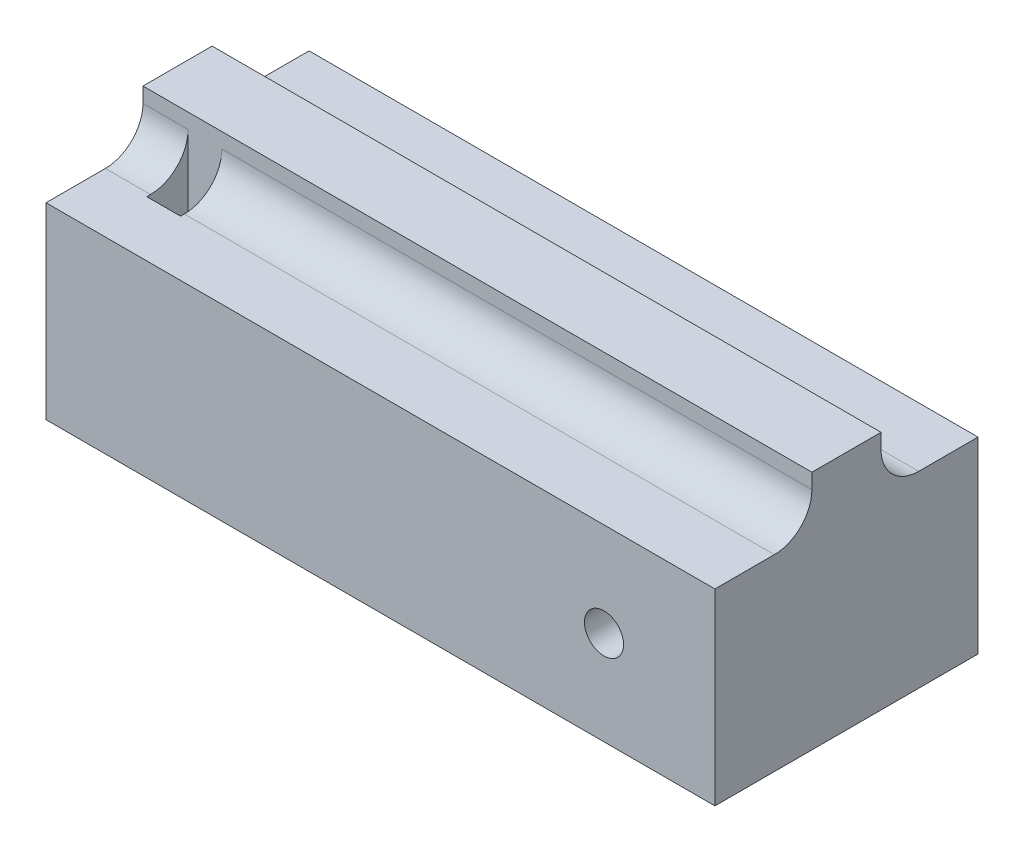
ISO-10303-21;
HEADER;
FILE_DESCRIPTION(('STEP AP214'),'2;1');
FILE_NAME('part.step','',(''),(''),'','','');
FILE_SCHEMA(('AUTOMOTIVE_DESIGN { 1 0 10303 214 1 1 1 1 }'));
ENDSEC;
DATA;
#1=APPLICATION_CONTEXT('core data for automotive mechanical design processes');
#2=APPLICATION_PROTOCOL_DEFINITION('international standard','automotive_design',2000,#1);
#3=PRODUCT_CONTEXT('',#1,'mechanical');
#4=PRODUCT('Part','Part','',(#3));
#5=PRODUCT_RELATED_PRODUCT_CATEGORY('part','',(#4));
#6=PRODUCT_DEFINITION_FORMATION('','',#4);
#7=PRODUCT_DEFINITION_CONTEXT('part definition',#1,'design');
#8=PRODUCT_DEFINITION('design','',#6,#7);
#9=PRODUCT_DEFINITION_SHAPE('','',#8);
#10=(LENGTH_UNIT() NAMED_UNIT(*) SI_UNIT(.MILLI.,.METRE.));
#11=(NAMED_UNIT(*) PLANE_ANGLE_UNIT() SI_UNIT($,.RADIAN.));
#12=(NAMED_UNIT(*) SI_UNIT($,.STERADIAN.) SOLID_ANGLE_UNIT());
#13=UNCERTAINTY_MEASURE_WITH_UNIT(LENGTH_MEASURE(1.E-05),#10,'distance_accuracy_value','');
#14=(GEOMETRIC_REPRESENTATION_CONTEXT(3) GLOBAL_UNCERTAINTY_ASSIGNED_CONTEXT((#13)) GLOBAL_UNIT_ASSIGNED_CONTEXT((#10,
#11,#12)) REPRESENTATION_CONTEXT('',''));
#15=CARTESIAN_POINT('',(0.,0.,0.));
#16=DIRECTION('',(0.,0.,1.));
#17=DIRECTION('',(1.,0.,0.));
#18=AXIS2_PLACEMENT_3D('',#15,#16,#17);
#19=CARTESIAN_POINT('',(-121.,45.01,113.404197468692));
#20=DIRECTION('',(1.,0.,0.));
#21=DIRECTION('',(0.,0.,-1.));
#22=AXIS2_PLACEMENT_3D('',#19,#20,#21);
#23=PLANE('',#22);
#24=CARTESIAN_POINT('',(-121.,30.,9.6));
#25=DIRECTION('',(1.,0.,0.));
#26=DIRECTION('',(0.,0.,-1.));
#27=AXIS2_PLACEMENT_3D('',#24,#25,#26);
#28=CIRCLE('',#27,5.);
#29=CARTESIAN_POINT('',(-121.,30.,4.6));
#30=VERTEX_POINT('',#29);
#31=CARTESIAN_POINT('',(-121.,25.,9.6));
#32=VERTEX_POINT('',#31);
#33=EDGE_CURVE('E40',#30,#32,#28,.F.);
#34=ORIENTED_EDGE('',*,*,#33,.T.);
#35=DIRECTION('',(0.,0.,1.));
#36=VECTOR('',#35,1.);
#37=CARTESIAN_POINT('',(-121.,25.,0.));
#38=LINE('',#37,#36);
#39=CARTESIAN_POINT('',(-121.,25.,17.5));
#40=VERTEX_POINT('',#39);
#41=EDGE_CURVE('E365',#32,#40,#38,.T.);
#42=ORIENTED_EDGE('',*,*,#41,.T.);
#43=DIRECTION('',(0.,-1.,0.));
#44=VECTOR('',#43,1.);
#45=CARTESIAN_POINT('',(-121.,25.,17.5));
#46=LINE('',#45,#44);
#47=CARTESIAN_POINT('',(-121.,0.,17.5));
#48=VERTEX_POINT('',#47);
#49=EDGE_CURVE('E362',#40,#48,#46,.T.);
#50=ORIENTED_EDGE('',*,*,#49,.T.);
#51=DIRECTION('',(0.,0.,1.));
#52=VECTOR('',#51,1.);
#53=CARTESIAN_POINT('',(-121.,0.,0.));
#54=LINE('',#53,#52);
#55=CARTESIAN_POINT('',(-121.,0.,-17.5));
#56=VERTEX_POINT('',#55);
#57=EDGE_CURVE('E368',#56,#48,#54,.T.);
#58=ORIENTED_EDGE('',*,*,#57,.F.);
#59=DIRECTION('',(0.,-1.,0.));
#60=VECTOR('',#59,1.);
#61=CARTESIAN_POINT('',(-121.,25.,-17.5));
#62=LINE('',#61,#60);
#63=CARTESIAN_POINT('',(-121.,25.,-17.5));
#64=VERTEX_POINT('',#63);
#65=EDGE_CURVE('E366',#64,#56,#62,.T.);
#66=ORIENTED_EDGE('',*,*,#65,.F.);
#67=DIRECTION('',(0.,0.,1.));
#68=VECTOR('',#67,1.);
#69=CARTESIAN_POINT('',(-121.,25.,0.));
#70=LINE('',#69,#68);
#71=CARTESIAN_POINT('',(-121.,25.,-9.60000000000003));
#72=VERTEX_POINT('',#71);
#73=EDGE_CURVE('E363',#64,#72,#70,.T.);
#74=ORIENTED_EDGE('',*,*,#73,.T.);
#75=CARTESIAN_POINT('',(-121.,30.,-9.60000000000003));
#76=DIRECTION('',(1.,0.,0.));
#77=DIRECTION('',(0.,0.,-1.));
#78=AXIS2_PLACEMENT_3D('',#75,#76,#77);
#79=CIRCLE('',#78,5.);
#80=CARTESIAN_POINT('',(-121.,30.,-4.60000000000003));
#81=VERTEX_POINT('',#80);
#82=EDGE_CURVE('E11',#72,#81,#79,.F.);
#83=ORIENTED_EDGE('',*,*,#82,.T.);
#84=DIRECTION('',(0.,1.,0.));
#85=VECTOR('',#84,1.);
#86=CARTESIAN_POINT('',(-121.,-21.,-4.60000000000003));
#87=LINE('',#86,#85);
#88=CARTESIAN_POINT('',(-121.,32.,-4.60000000000005));
#89=VERTEX_POINT('',#88);
#90=EDGE_CURVE('E359',#81,#89,#87,.T.);
#91=ORIENTED_EDGE('',*,*,#90,.T.);
#92=DIRECTION('',(0.,0.,-1.));
#93=VECTOR('',#92,1.);
#94=CARTESIAN_POINT('',(-121.,32.,0.));
#95=LINE('',#94,#93);
#96=CARTESIAN_POINT('',(-121.,32.,4.60000000000009));
#97=VERTEX_POINT('',#96);
#98=EDGE_CURVE('E178',#97,#89,#95,.T.);
#99=ORIENTED_EDGE('',*,*,#98,.F.);
#100=DIRECTION('',(0.,-1.,0.));
#101=VECTOR('',#100,1.);
#102=CARTESIAN_POINT('',(-121.,-21.,4.6));
#103=LINE('',#102,#101);
#104=EDGE_CURVE('E361',#97,#30,#103,.T.);
#105=ORIENTED_EDGE('',*,*,#104,.T.);
#106=EDGE_LOOP('',(#34,#42,#50,#58,#66,#74,#83,#91,#99,#105));
#107=FACE_BOUND('',#106,.T.);
#108=ADVANCED_FACE('F32',(#107),#23,.T.);
#109=CARTESIAN_POINT('',(-200.,12.5,0.));
#110=DIRECTION('',(-1.,0.,0.));
#111=DIRECTION('',(0.,0.,1.));
#112=AXIS2_PLACEMENT_3D('',#109,#110,#111);
#113=PLANE('',#112);
#114=CARTESIAN_POINT('',(-200.,12.5,0.));
#115=DIRECTION('',(-1.,0.,0.));
#116=DIRECTION('',(0.,0.,1.));
#117=AXIS2_PLACEMENT_3D('',#114,#115,#116);
#118=CIRCLE('',#117,2.38063164328391);
#119=CARTESIAN_POINT('',(-200.,12.5,2.38063164328383));
#120=VERTEX_POINT('',#119);
#121=EDGE_CURVE('E201',#120,#120,#118,.T.);
#122=ORIENTED_EDGE('',*,*,#121,.T.);
#123=EDGE_LOOP('',(#122));
#124=FACE_BOUND('',#123,.T.);
#125=ADVANCED_FACE('F446',(#124),#113,.T.);
#126=CARTESIAN_POINT('',(-180.,19.25,7.8));
#127=DIRECTION('',(-1.,0.,0.));
#128=DIRECTION('',(0.,0.,1.));
#129=AXIS2_PLACEMENT_3D('',#126,#127,#128);
#130=PLANE('',#129);
#131=CARTESIAN_POINT('',(-180.,19.25,7.8));
#132=DIRECTION('',(-1.,0.,0.));
#133=DIRECTION('',(0.,0.,1.));
#134=AXIS2_PLACEMENT_3D('',#131,#132,#133);
#135=CIRCLE('',#134,2.);
#136=CARTESIAN_POINT('',(-180.,19.25,9.8));
#137=VERTEX_POINT('',#136);
#138=EDGE_CURVE('E286',#137,#137,#135,.T.);
#139=ORIENTED_EDGE('',*,*,#138,.T.);
#140=EDGE_LOOP('',(#139));
#141=FACE_BOUND('',#140,.T.);
#142=ADVANCED_FACE('F450',(#141),#130,.T.);
#143=CARTESIAN_POINT('',(-180.,5.75,7.8));
#144=DIRECTION('',(-1.,0.,0.));
#145=DIRECTION('',(0.,0.,1.));
#146=AXIS2_PLACEMENT_3D('',#143,#144,#145);
#147=PLANE('',#146);
#148=CARTESIAN_POINT('',(-180.,5.75,7.8));
#149=DIRECTION('',(-1.,0.,0.));
#150=DIRECTION('',(0.,0.,1.));
#151=AXIS2_PLACEMENT_3D('',#148,#149,#150);
#152=CIRCLE('',#151,2.);
#153=CARTESIAN_POINT('',(-180.,5.75,9.8));
#154=VERTEX_POINT('',#153);
#155=EDGE_CURVE('E268',#154,#154,#152,.T.);
#156=ORIENTED_EDGE('',*,*,#155,.T.);
#157=EDGE_LOOP('',(#156));
#158=FACE_BOUND('',#157,.T.);
#159=ADVANCED_FACE('F491',(#158),#147,.T.);
#160=CARTESIAN_POINT('',(-180.,5.75,-7.8));
#161=DIRECTION('',(-1.,0.,0.));
#162=DIRECTION('',(0.,0.,1.));
#163=AXIS2_PLACEMENT_3D('',#160,#161,#162);
#164=PLANE('',#163);
#165=CARTESIAN_POINT('',(-180.,5.75,-7.8));
#166=DIRECTION('',(-1.,0.,0.));
#167=DIRECTION('',(0.,0.,1.));
#168=AXIS2_PLACEMENT_3D('',#165,#166,#167);
#169=CIRCLE('',#168,2.);
#170=CARTESIAN_POINT('',(-180.,5.75,-5.8));
#171=VERTEX_POINT('',#170);
#172=EDGE_CURVE('E275',#171,#171,#169,.T.);
#173=ORIENTED_EDGE('',*,*,#172,.T.);
#174=EDGE_LOOP('',(#173));
#175=FACE_BOUND('',#174,.T.);
#176=ADVANCED_FACE('F494',(#175),#164,.T.);
#177=CARTESIAN_POINT('',(-180.,19.25,-7.8));
#178=DIRECTION('',(-1.,0.,0.));
#179=DIRECTION('',(0.,0.,1.));
#180=AXIS2_PLACEMENT_3D('',#177,#178,#179);
#181=PLANE('',#180);
#182=CARTESIAN_POINT('',(-180.,19.25,-7.8));
#183=DIRECTION('',(-1.,0.,0.));
#184=DIRECTION('',(0.,0.,1.));
#185=AXIS2_PLACEMENT_3D('',#182,#183,#184);
#186=CIRCLE('',#185,2.);
#187=CARTESIAN_POINT('',(-180.,19.25,-5.79999999999999));
#188=VERTEX_POINT('',#187);
#189=EDGE_CURVE('E281',#188,#188,#186,.T.);
#190=ORIENTED_EDGE('',*,*,#189,.T.);
#191=EDGE_LOOP('',(#190));
#192=FACE_BOUND('',#191,.T.);
#193=ADVANCED_FACE('F505',(#192),#181,.T.);
#194=CARTESIAN_POINT('',(-180.,19.25,7.8));
#195=DIRECTION('',(-1.,0.,0.));
#196=DIRECTION('',(0.,0.,1.));
#197=AXIS2_PLACEMENT_3D('',#194,#195,#196);
#198=CYLINDRICAL_SURFACE('',#197,2.);
#199=CARTESIAN_POINT('',(-204.,19.25,7.8));
#200=DIRECTION('',(-1.,0.,0.));
#201=DIRECTION('',(0.,0.,1.));
#202=AXIS2_PLACEMENT_3D('',#199,#200,#201);
#203=CIRCLE('',#202,2.);
#204=CARTESIAN_POINT('',(-204.,19.25,9.8));
#205=VERTEX_POINT('',#204);
#206=EDGE_CURVE('E256',#205,#205,#203,.F.);
#207=ORIENTED_EDGE('',*,*,#206,.T.);
#208=EDGE_LOOP('',(#207));
#209=FACE_BOUND('',#208,.T.);
#210=CARTESIAN_POINT('',(-210.,19.25,7.8));
#211=DIRECTION('',(-1.,0.,0.));
#212=DIRECTION('',(0.,0.,1.));
#213=AXIS2_PLACEMENT_3D('',#210,#211,#212);
#214=CIRCLE('',#213,2.);
#215=CARTESIAN_POINT('',(-210.,19.25,9.8));
#216=VERTEX_POINT('',#215);
#217=EDGE_CURVE('E271',#216,#216,#214,.T.);
#218=ORIENTED_EDGE('',*,*,#217,.T.);
#219=EDGE_LOOP('',(#218));
#220=FACE_BOUND('',#219,.T.);
#221=ADVANCED_FACE('F500',(#209,#220),#198,.F.);
#222=CARTESIAN_POINT('',(-180.,5.75,7.8));
#223=DIRECTION('',(-1.,0.,0.));
#224=DIRECTION('',(0.,0.,1.));
#225=AXIS2_PLACEMENT_3D('',#222,#223,#224);
#226=CYLINDRICAL_SURFACE('',#225,2.);
#227=CARTESIAN_POINT('',(-204.,5.75,7.8));
#228=DIRECTION('',(-1.,0.,0.));
#229=DIRECTION('',(0.,0.,1.));
#230=AXIS2_PLACEMENT_3D('',#227,#228,#229);
#231=CIRCLE('',#230,2.);
#232=CARTESIAN_POINT('',(-204.,5.75,9.8));
#233=VERTEX_POINT('',#232);
#234=EDGE_CURVE('E255',#233,#233,#231,.F.);
#235=ORIENTED_EDGE('',*,*,#234,.T.);
#236=EDGE_LOOP('',(#235));
#237=FACE_BOUND('',#236,.T.);
#238=CARTESIAN_POINT('',(-210.,5.75,7.8));
#239=DIRECTION('',(-1.,0.,0.));
#240=DIRECTION('',(0.,0.,1.));
#241=AXIS2_PLACEMENT_3D('',#238,#239,#240);
#242=CIRCLE('',#241,2.);
#243=CARTESIAN_POINT('',(-210.,5.75,9.8));
#244=VERTEX_POINT('',#243);
#245=EDGE_CURVE('E272',#244,#244,#242,.T.);
#246=ORIENTED_EDGE('',*,*,#245,.T.);
#247=EDGE_LOOP('',(#246));
#248=FACE_BOUND('',#247,.T.);
#249=ADVANCED_FACE('F496',(#237,#248),#226,.F.);
#250=CARTESIAN_POINT('',(-180.,5.75,-7.8));
#251=DIRECTION('',(-1.,0.,0.));
#252=DIRECTION('',(0.,0.,1.));
#253=AXIS2_PLACEMENT_3D('',#250,#251,#252);
#254=CYLINDRICAL_SURFACE('',#253,2.);
#255=CARTESIAN_POINT('',(-204.,5.75,-7.8));
#256=DIRECTION('',(-1.,0.,0.));
#257=DIRECTION('',(0.,0.,1.));
#258=AXIS2_PLACEMENT_3D('',#255,#256,#257);
#259=CIRCLE('',#258,2.);
#260=CARTESIAN_POINT('',(-204.,5.75,-5.8));
#261=VERTEX_POINT('',#260);
#262=EDGE_CURVE('E244',#261,#261,#259,.F.);
#263=ORIENTED_EDGE('',*,*,#262,.T.);
#264=EDGE_LOOP('',(#263));
#265=FACE_BOUND('',#264,.T.);
#266=CARTESIAN_POINT('',(-210.,5.75,-7.8));
#267=DIRECTION('',(-1.,0.,0.));
#268=DIRECTION('',(0.,0.,1.));
#269=AXIS2_PLACEMENT_3D('',#266,#267,#268);
#270=CIRCLE('',#269,2.);
#271=CARTESIAN_POINT('',(-210.,5.75,-5.8));
#272=VERTEX_POINT('',#271);
#273=EDGE_CURVE('E278',#272,#272,#270,.T.);
#274=ORIENTED_EDGE('',*,*,#273,.T.);
#275=EDGE_LOOP('',(#274));
#276=FACE_BOUND('',#275,.T.);
#277=ADVANCED_FACE('F499',(#265,#276),#254,.F.);
#278=CARTESIAN_POINT('',(-180.,19.25,-7.8));
#279=DIRECTION('',(-1.,0.,0.));
#280=DIRECTION('',(0.,0.,1.));
#281=AXIS2_PLACEMENT_3D('',#278,#279,#280);
#282=CYLINDRICAL_SURFACE('',#281,2.);
#283=CARTESIAN_POINT('',(-204.,19.25,-7.8));
#284=DIRECTION('',(-1.,0.,0.));
#285=DIRECTION('',(0.,0.,1.));
#286=AXIS2_PLACEMENT_3D('',#283,#284,#285);
#287=CIRCLE('',#286,2.);
#288=CARTESIAN_POINT('',(-204.,19.25,-5.79999999999999));
#289=VERTEX_POINT('',#288);
#290=EDGE_CURVE('E221',#289,#289,#287,.F.);
#291=ORIENTED_EDGE('',*,*,#290,.T.);
#292=EDGE_LOOP('',(#291));
#293=FACE_BOUND('',#292,.T.);
#294=CARTESIAN_POINT('',(-210.,19.25,-7.8));
#295=DIRECTION('',(-1.,0.,0.));
#296=DIRECTION('',(0.,0.,1.));
#297=AXIS2_PLACEMENT_3D('',#294,#295,#296);
#298=CIRCLE('',#297,2.);
#299=CARTESIAN_POINT('',(-210.,19.25,-5.79999999999999));
#300=VERTEX_POINT('',#299);
#301=EDGE_CURVE('E267',#300,#300,#298,.T.);
#302=ORIENTED_EDGE('',*,*,#301,.T.);
#303=EDGE_LOOP('',(#302));
#304=FACE_BOUND('',#303,.T.);
#305=ADVANCED_FACE('F468',(#293,#304),#282,.F.);
#306=CARTESIAN_POINT('',(-200.,12.5,0.));
#307=DIRECTION('',(-1.,0.,0.));
#308=DIRECTION('',(0.,0.,1.));
#309=AXIS2_PLACEMENT_3D('',#306,#307,#308);
#310=CYLINDRICAL_SURFACE('',#309,2.38063164328391);
#311=ORIENTED_EDGE('',*,*,#121,.F.);
#312=EDGE_LOOP('',(#311));
#313=FACE_BOUND('',#312,.T.);
#314=CARTESIAN_POINT('',(-210.,12.5,0.));
#315=DIRECTION('',(-1.,0.,0.));
#316=DIRECTION('',(0.,0.,1.));
#317=AXIS2_PLACEMENT_3D('',#314,#315,#316);
#318=CIRCLE('',#317,2.38063164328391);
#319=CARTESIAN_POINT('',(-210.,12.5,2.38063164328383));
#320=VERTEX_POINT('',#319);
#321=EDGE_CURVE('E198',#320,#320,#318,.T.);
#322=ORIENTED_EDGE('',*,*,#321,.T.);
#323=EDGE_LOOP('',(#322));
#324=FACE_BOUND('',#323,.T.);
#325=ADVANCED_FACE('F464',(#313,#324),#310,.F.);
#326=CARTESIAN_POINT('',(-199.5,19.25,7.8));
#327=DIRECTION('',(1.,0.,0.));
#328=DIRECTION('',(0.,0.,-1.));
#329=AXIS2_PLACEMENT_3D('',#326,#327,#328);
#330=CIRCLE('',#329,2.);
#331=CARTESIAN_POINT('',(-199.5,19.25,5.80000000000001));
#332=VERTEX_POINT('',#331);
#333=EDGE_CURVE('E262',#332,#332,#330,.F.);
#334=ORIENTED_EDGE('',*,*,#333,.T.);
#335=EDGE_LOOP('',(#334));
#336=FACE_BOUND('',#335,.T.);
#337=ORIENTED_EDGE('',*,*,#138,.F.);
#338=EDGE_LOOP('',(#337));
#339=FACE_BOUND('',#338,.T.);
#340=ADVANCED_FACE('F467',(#336,#339),#198,.F.);
#341=CARTESIAN_POINT('',(-199.5,5.75,7.8));
#342=DIRECTION('',(1.,0.,0.));
#343=DIRECTION('',(0.,0.,-1.));
#344=AXIS2_PLACEMENT_3D('',#341,#342,#343);
#345=CIRCLE('',#344,2.);
#346=CARTESIAN_POINT('',(-199.5,5.75,5.8));
#347=VERTEX_POINT('',#346);
#348=EDGE_CURVE('E261',#347,#347,#345,.F.);
#349=ORIENTED_EDGE('',*,*,#348,.T.);
#350=EDGE_LOOP('',(#349));
#351=FACE_BOUND('',#350,.T.);
#352=ORIENTED_EDGE('',*,*,#155,.F.);
#353=EDGE_LOOP('',(#352));
#354=FACE_BOUND('',#353,.T.);
#355=ADVANCED_FACE('F502',(#351,#354),#226,.F.);
#356=CARTESIAN_POINT('',(-199.5,5.75,-7.8));
#357=DIRECTION('',(1.,0.,0.));
#358=DIRECTION('',(0.,0.,-1.));
#359=AXIS2_PLACEMENT_3D('',#356,#357,#358);
#360=CIRCLE('',#359,2.);
#361=CARTESIAN_POINT('',(-199.5,5.75,-9.8));
#362=VERTEX_POINT('',#361);
#363=EDGE_CURVE('E250',#362,#362,#360,.F.);
#364=ORIENTED_EDGE('',*,*,#363,.T.);
#365=EDGE_LOOP('',(#364));
#366=FACE_BOUND('',#365,.T.);
#367=ORIENTED_EDGE('',*,*,#172,.F.);
#368=EDGE_LOOP('',(#367));
#369=FACE_BOUND('',#368,.T.);
#370=ADVANCED_FACE('F510',(#366,#369),#254,.F.);
#371=CARTESIAN_POINT('',(-199.5,19.25,-7.8));
#372=DIRECTION('',(1.,0.,0.));
#373=DIRECTION('',(0.,0.,-1.));
#374=AXIS2_PLACEMENT_3D('',#371,#372,#373);
#375=CIRCLE('',#374,2.);
#376=CARTESIAN_POINT('',(-199.5,19.25,-9.8));
#377=VERTEX_POINT('',#376);
#378=EDGE_CURVE('E249',#377,#377,#375,.F.);
#379=ORIENTED_EDGE('',*,*,#378,.T.);
#380=EDGE_LOOP('',(#379));
#381=FACE_BOUND('',#380,.T.);
#382=ORIENTED_EDGE('',*,*,#189,.F.);
#383=EDGE_LOOP('',(#382));
#384=FACE_BOUND('',#383,.T.);
#385=ADVANCED_FACE('F442',(#381,#384),#282,.F.);
#386=CARTESIAN_POINT('',(-210.,25.,17.5));
#387=DIRECTION('',(0.,0.,-1.));
#388=DIRECTION('',(-1.,0.,0.));
#389=AXIS2_PLACEMENT_3D('',#386,#387,#388);
#390=PLANE('',#389);
#391=CARTESIAN_POINT('',(-135.759248767884,12.5,17.5));
#392=DIRECTION('',(0.,0.,-1.));
#393=DIRECTION('',(-1.,0.,0.));
#394=AXIS2_PLACEMENT_3D('',#391,#392,#393);
#395=CIRCLE('',#394,2.59999999999999);
#396=CARTESIAN_POINT('',(-138.359248767884,12.5,17.5));
#397=VERTEX_POINT('',#396);
#398=EDGE_CURVE('E182',#397,#397,#395,.T.);
#399=ORIENTED_EDGE('',*,*,#398,.T.);
#400=EDGE_LOOP('',(#399));
#401=FACE_BOUND('',#400,.T.);
#402=ORIENTED_EDGE('',*,*,#49,.F.);
#403=DIRECTION('',(1.,0.,0.));
#404=VECTOR('',#403,1.);
#405=CARTESIAN_POINT('',(-210.,25.,17.5));
#406=LINE('',#405,#404);
#407=CARTESIAN_POINT('',(-210.,25.,17.5));
#408=VERTEX_POINT('',#407);
#409=EDGE_CURVE('E299',#408,#40,#406,.T.);
#410=ORIENTED_EDGE('',*,*,#409,.F.);
#411=DIRECTION('',(0.,-1.,0.));
#412=VECTOR('',#411,1.);
#413=CARTESIAN_POINT('',(-210.,25.,17.5));
#414=LINE('',#413,#412);
#415=CARTESIAN_POINT('',(-210.,0.,17.5));
#416=VERTEX_POINT('',#415);
#417=EDGE_CURVE('E310',#408,#416,#414,.T.);
#418=ORIENTED_EDGE('',*,*,#417,.T.);
#419=DIRECTION('',(1.,0.,0.));
#420=VECTOR('',#419,1.);
#421=CARTESIAN_POINT('',(-210.,0.,17.5));
#422=LINE('',#421,#420);
#423=EDGE_CURVE('E307',#416,#48,#422,.T.);
#424=ORIENTED_EDGE('',*,*,#423,.T.);
#425=EDGE_LOOP('',(#402,#410,#418,#424));
#426=FACE_BOUND('',#425,.T.);
#427=ADVANCED_FACE('F385',(#401,#426),#390,.F.);
#428=CARTESIAN_POINT('',(-210.,25.,-17.5));
#429=DIRECTION('',(0.,0.,-1.));
#430=DIRECTION('',(-1.,0.,0.));
#431=AXIS2_PLACEMENT_3D('',#428,#429,#430);
#432=PLANE('',#431);
#433=CARTESIAN_POINT('',(-135.759248767884,12.5,-17.5));
#434=DIRECTION('',(0.,0.,-1.));
#435=DIRECTION('',(-1.,0.,0.));
#436=AXIS2_PLACEMENT_3D('',#433,#434,#435);
#437=CIRCLE('',#436,2.59999999999999);
#438=CARTESIAN_POINT('',(-138.359248767884,12.5,-17.5));
#439=VERTEX_POINT('',#438);
#440=EDGE_CURVE('E35',#439,#439,#437,.T.);
#441=ORIENTED_EDGE('',*,*,#440,.F.);
#442=EDGE_LOOP('',(#441));
#443=FACE_BOUND('',#442,.T.);
#444=DIRECTION('',(1.,0.,0.));
#445=VECTOR('',#444,1.);
#446=CARTESIAN_POINT('',(-210.,25.,-17.5));
#447=LINE('',#446,#445);
#448=CARTESIAN_POINT('',(-210.,25.,-17.5));
#449=VERTEX_POINT('',#448);
#450=EDGE_CURVE('E295',#449,#64,#447,.T.);
#451=ORIENTED_EDGE('',*,*,#450,.T.);
#452=ORIENTED_EDGE('',*,*,#65,.T.);
#453=DIRECTION('',(1.,0.,0.));
#454=VECTOR('',#453,1.);
#455=CARTESIAN_POINT('',(-210.,0.,-17.5));
#456=LINE('',#455,#454);
#457=CARTESIAN_POINT('',(-210.,0.,-17.5));
#458=VERTEX_POINT('',#457);
#459=EDGE_CURVE('E304',#458,#56,#456,.T.);
#460=ORIENTED_EDGE('',*,*,#459,.F.);
#461=DIRECTION('',(0.,-1.,0.));
#462=VECTOR('',#461,1.);
#463=CARTESIAN_POINT('',(-210.,25.,-17.5));
#464=LINE('',#463,#462);
#465=EDGE_CURVE('E301',#449,#458,#464,.T.);
#466=ORIENTED_EDGE('',*,*,#465,.F.);
#467=EDGE_LOOP('',(#451,#452,#460,#466));
#468=FACE_BOUND('',#467,.T.);
#469=ADVANCED_FACE('F395',(#443,#468),#432,.T.);
#470=CARTESIAN_POINT('',(-204.,-21.,-10.1));
#471=DIRECTION('',(0.,0.,-1.));
#472=DIRECTION('',(-1.,0.,0.));
#473=AXIS2_PLACEMENT_3D('',#470,#471,#472);
#474=PLANE('',#473);
#475=DIRECTION('',(1.,0.,0.));
#476=VECTOR('',#475,1.);
#477=CARTESIAN_POINT('',(0.,0.,-10.1));
#478=LINE('',#477,#476);
#479=CARTESIAN_POINT('',(-204.,0.,-10.1));
#480=VERTEX_POINT('',#479);
#481=CARTESIAN_POINT('',(-199.5,0.,-10.1));
#482=VERTEX_POINT('',#481);
#483=EDGE_CURVE('E324',#480,#482,#478,.T.);
#484=ORIENTED_EDGE('',*,*,#483,.T.);
#485=DIRECTION('',(0.,1.,0.));
#486=VECTOR('',#485,1.);
#487=CARTESIAN_POINT('',(-199.5,-21.,-10.1));
#488=LINE('',#487,#486);
#489=CARTESIAN_POINT('',(-199.5,25.,-10.1));
#490=VERTEX_POINT('',#489);
#491=EDGE_CURVE('E212',#482,#490,#488,.T.);
#492=ORIENTED_EDGE('',*,*,#491,.T.);
#493=DIRECTION('',(-1.,0.,0.));
#494=VECTOR('',#493,1.);
#495=CARTESIAN_POINT('',(-204.,25.,-10.1));
#496=LINE('',#495,#494);
#497=CARTESIAN_POINT('',(-204.,25.,-10.1));
#498=VERTEX_POINT('',#497);
#499=EDGE_CURVE('E207',#490,#498,#496,.T.);
#500=ORIENTED_EDGE('',*,*,#499,.T.);
#501=DIRECTION('',(0.,1.,0.));
#502=VECTOR('',#501,1.);
#503=CARTESIAN_POINT('',(-204.,-21.,-10.1));
#504=LINE('',#503,#502);
#505=EDGE_CURVE('E234',#480,#498,#504,.T.);
#506=ORIENTED_EDGE('',*,*,#505,.F.);
#507=EDGE_LOOP('',(#484,#492,#500,#506));
#508=FACE_BOUND('',#507,.T.);
#509=ADVANCED_FACE('F408',(#508),#474,.F.);
#510=CARTESIAN_POINT('',(-199.5,-21.,10.1));
#511=DIRECTION('',(0.,0.,1.));
#512=DIRECTION('',(1.,0.,0.));
#513=AXIS2_PLACEMENT_3D('',#510,#511,#512);
#514=PLANE('',#513);
#515=DIRECTION('',(-1.,0.,0.));
#516=VECTOR('',#515,1.);
#517=CARTESIAN_POINT('',(0.,0.,10.0999999999999));
#518=LINE('',#517,#516);
#519=CARTESIAN_POINT('',(-199.5,0.,10.1));
#520=VERTEX_POINT('',#519);
#521=CARTESIAN_POINT('',(-204.,0.,10.1));
#522=VERTEX_POINT('',#521);
#523=EDGE_CURVE('E326',#520,#522,#518,.T.);
#524=ORIENTED_EDGE('',*,*,#523,.T.);
#525=DIRECTION('',(0.,1.,0.));
#526=VECTOR('',#525,1.);
#527=CARTESIAN_POINT('',(-204.,-21.,10.1));
#528=LINE('',#527,#526);
#529=CARTESIAN_POINT('',(-204.,25.,10.1));
#530=VERTEX_POINT('',#529);
#531=EDGE_CURVE('E224',#522,#530,#528,.T.);
#532=ORIENTED_EDGE('',*,*,#531,.T.);
#533=DIRECTION('',(1.,0.,0.));
#534=VECTOR('',#533,1.);
#535=CARTESIAN_POINT('',(-199.5,25.,10.1));
#536=LINE('',#535,#534);
#537=CARTESIAN_POINT('',(-199.5,25.,10.1));
#538=VERTEX_POINT('',#537);
#539=EDGE_CURVE('E211',#530,#538,#536,.T.);
#540=ORIENTED_EDGE('',*,*,#539,.T.);
#541=DIRECTION('',(0.,1.,0.));
#542=VECTOR('',#541,1.);
#543=CARTESIAN_POINT('',(-199.5,-21.,10.1));
#544=LINE('',#543,#542);
#545=EDGE_CURVE('E222',#520,#538,#544,.T.);
#546=ORIENTED_EDGE('',*,*,#545,.F.);
#547=EDGE_LOOP('',(#524,#532,#540,#546));
#548=FACE_BOUND('',#547,.T.);
#549=ADVANCED_FACE('F440',(#548),#514,.F.);
#550=CARTESIAN_POINT('',(-199.5,30.,-9.6));
#551=DIRECTION('',(1.,0.,0.));
#552=DIRECTION('',(0.,0.,-1.));
#553=AXIS2_PLACEMENT_3D('',#550,#551,#552);
#554=CYLINDRICAL_SURFACE('',#553,5.);
#555=CARTESIAN_POINT('',(-204.,30.,-9.6));
#556=DIRECTION('',(-1.,0.,0.));
#557=DIRECTION('',(0.,0.,1.));
#558=AXIS2_PLACEMENT_3D('',#555,#556,#557);
#559=CIRCLE('',#558,5.);
#560=CARTESIAN_POINT('',(-204.,25.,-9.6));
#561=VERTEX_POINT('',#560);
#562=CARTESIAN_POINT('',(-204.,30.,-4.6));
#563=VERTEX_POINT('',#562);
#564=EDGE_CURVE('E354',#561,#563,#559,.T.);
#565=ORIENTED_EDGE('',*,*,#564,.F.);
#566=DIRECTION('',(-1.,0.,0.));
#567=VECTOR('',#566,1.);
#568=CARTESIAN_POINT('',(-204.,25.,-9.6));
#569=LINE('',#568,#567);
#570=CARTESIAN_POINT('',(-210.,25.,-9.6));
#571=VERTEX_POINT('',#570);
#572=EDGE_CURVE('E343',#571,#561,#569,.F.);
#573=ORIENTED_EDGE('',*,*,#572,.F.);
#574=CARTESIAN_POINT('',(-210.,30.,-9.6));
#575=DIRECTION('',(-1.,0.,0.));
#576=DIRECTION('',(0.,0.,1.));
#577=AXIS2_PLACEMENT_3D('',#574,#575,#576);
#578=CIRCLE('',#577,5.);
#579=CARTESIAN_POINT('',(-210.,30.,-4.60000000000009));
#580=VERTEX_POINT('',#579);
#581=EDGE_CURVE('E352',#580,#571,#578,.F.);
#582=ORIENTED_EDGE('',*,*,#581,.F.);
#583=DIRECTION('',(-1.,0.,0.));
#584=VECTOR('',#583,1.);
#585=CARTESIAN_POINT('',(-210.,30.,-4.6));
#586=LINE('',#585,#584);
#587=EDGE_CURVE('E197',#563,#580,#586,.T.);
#588=ORIENTED_EDGE('',*,*,#587,.F.);
#589=EDGE_LOOP('',(#565,#573,#582,#588));
#590=FACE_BOUND('',#589,.T.);
#591=ADVANCED_FACE('F401',(#590),#554,.F.);
#592=CARTESIAN_POINT('',(-204.,-21.,-4.6));
#593=DIRECTION('',(-1.,0.,0.));
#594=DIRECTION('',(0.,0.,1.));
#595=AXIS2_PLACEMENT_3D('',#592,#593,#594);
#596=PLANE('',#595);
#597=DIRECTION('',(0.,0.,-1.));
#598=VECTOR('',#597,1.);
#599=CARTESIAN_POINT('',(-204.,0.,0.));
#600=LINE('',#599,#598);
#601=CARTESIAN_POINT('',(-204.,0.,-4.6));
#602=VERTEX_POINT('',#601);
#603=EDGE_CURVE('E247',#602,#480,#600,.T.);
#604=ORIENTED_EDGE('',*,*,#603,.T.);
#605=ORIENTED_EDGE('',*,*,#505,.T.);
#606=DIRECTION('',(0.,0.,1.));
#607=VECTOR('',#606,1.);
#608=CARTESIAN_POINT('',(-204.,25.,-4.6));
#609=LINE('',#608,#607);
#610=EDGE_CURVE('E229',#498,#561,#609,.T.);
#611=ORIENTED_EDGE('',*,*,#610,.T.);
#612=ORIENTED_EDGE('',*,*,#564,.T.);
#613=DIRECTION('',(0.,1.,0.));
#614=VECTOR('',#613,1.);
#615=CARTESIAN_POINT('',(-204.,-21.,-4.6));
#616=LINE('',#615,#614);
#617=EDGE_CURVE('E240',#602,#563,#616,.T.);
#618=ORIENTED_EDGE('',*,*,#617,.F.);
#619=EDGE_LOOP('',(#604,#605,#611,#612,#618));
#620=FACE_BOUND('',#619,.T.);
#621=ORIENTED_EDGE('',*,*,#290,.F.);
#622=EDGE_LOOP('',(#621));
#623=FACE_BOUND('',#622,.T.);
#624=ORIENTED_EDGE('',*,*,#262,.F.);
#625=EDGE_LOOP('',(#624));
#626=FACE_BOUND('',#625,.T.);
#627=ADVANCED_FACE('F403',(#620,#623,#626),#596,.F.);
#628=CARTESIAN_POINT('',(0.,0.,0.));
#629=DIRECTION('',(0.,-1.,0.));
#630=DIRECTION('',(0.,0.,-1.));
#631=AXIS2_PLACEMENT_3D('',#628,#629,#630);
#632=PLANE('',#631);
#633=DIRECTION('',(1.,0.,0.));
#634=VECTOR('',#633,1.);
#635=CARTESIAN_POINT('',(0.,0.,4.6));
#636=LINE('',#635,#634);
#637=CARTESIAN_POINT('',(-204.,0.,4.6));
#638=VERTEX_POINT('',#637);
#639=CARTESIAN_POINT('',(-199.5,0.,4.6));
#640=VERTEX_POINT('',#639);
#641=EDGE_CURVE('E329',#638,#640,#636,.T.);
#642=ORIENTED_EDGE('',*,*,#641,.F.);
#643=DIRECTION('',(0.,0.,-1.));
#644=VECTOR('',#643,1.);
#645=CARTESIAN_POINT('',(-204.,0.,0.));
#646=LINE('',#645,#644);
#647=EDGE_CURVE('E259',#522,#638,#646,.T.);
#648=ORIENTED_EDGE('',*,*,#647,.F.);
#649=ORIENTED_EDGE('',*,*,#523,.F.);
#650=DIRECTION('',(0.,0.,1.));
#651=VECTOR('',#650,1.);
#652=CARTESIAN_POINT('',(-199.5,0.,0.));
#653=LINE('',#652,#651);
#654=EDGE_CURVE('E265',#640,#520,#653,.T.);
#655=ORIENTED_EDGE('',*,*,#654,.F.);
#656=EDGE_LOOP('',(#642,#648,#649,#655));
#657=FACE_BOUND('',#656,.T.);
#658=ORIENTED_EDGE('',*,*,#483,.F.);
#659=ORIENTED_EDGE('',*,*,#603,.F.);
#660=DIRECTION('',(-1.,0.,0.));
#661=VECTOR('',#660,1.);
#662=CARTESIAN_POINT('',(0.,0.,-4.60000000000008));
#663=LINE('',#662,#661);
#664=CARTESIAN_POINT('',(-199.5,0.,-4.6));
#665=VERTEX_POINT('',#664);
#666=EDGE_CURVE('E312',#665,#602,#663,.T.);
#667=ORIENTED_EDGE('',*,*,#666,.F.);
#668=DIRECTION('',(0.,0.,1.));
#669=VECTOR('',#668,1.);
#670=CARTESIAN_POINT('',(-199.5,0.,0.));
#671=LINE('',#670,#669);
#672=EDGE_CURVE('E253',#482,#665,#671,.T.);
#673=ORIENTED_EDGE('',*,*,#672,.F.);
#674=EDGE_LOOP('',(#658,#659,#667,#673));
#675=FACE_BOUND('',#674,.T.);
#676=ORIENTED_EDGE('',*,*,#459,.T.);
#677=ORIENTED_EDGE('',*,*,#57,.T.);
#678=ORIENTED_EDGE('',*,*,#423,.F.);
#679=DIRECTION('',(0.,0.,-1.));
#680=VECTOR('',#679,1.);
#681=CARTESIAN_POINT('',(-210.,0.,17.5));
#682=LINE('',#681,#680);
#683=EDGE_CURVE('E289',#416,#458,#682,.T.);
#684=ORIENTED_EDGE('',*,*,#683,.T.);
#685=EDGE_LOOP('',(#676,#677,#678,#684));
#686=FACE_BOUND('',#685,.T.);
#687=ADVANCED_FACE('F389',(#657,#675,#686),#632,.T.);
#688=CARTESIAN_POINT('',(-204.,-21.,10.1));
#689=DIRECTION('',(-1.,0.,0.));
#690=DIRECTION('',(0.,0.,1.));
#691=AXIS2_PLACEMENT_3D('',#688,#689,#690);
#692=PLANE('',#691);
#693=ORIENTED_EDGE('',*,*,#647,.T.);
#694=DIRECTION('',(0.,1.,0.));
#695=VECTOR('',#694,1.);
#696=CARTESIAN_POINT('',(-204.,-21.,4.6));
#697=LINE('',#696,#695);
#698=CARTESIAN_POINT('',(-204.,30.,4.6));
#699=VERTEX_POINT('',#698);
#700=EDGE_CURVE('E218',#638,#699,#697,.T.);
#701=ORIENTED_EDGE('',*,*,#700,.T.);
#702=CARTESIAN_POINT('',(-204.,30.,9.6));
#703=DIRECTION('',(-1.,0.,0.));
#704=DIRECTION('',(0.,0.,1.));
#705=AXIS2_PLACEMENT_3D('',#702,#703,#704);
#706=CIRCLE('',#705,5.);
#707=CARTESIAN_POINT('',(-204.,25.,9.6));
#708=VERTEX_POINT('',#707);
#709=EDGE_CURVE('E345',#699,#708,#706,.T.);
#710=ORIENTED_EDGE('',*,*,#709,.T.);
#711=DIRECTION('',(0.,0.,1.));
#712=VECTOR('',#711,1.);
#713=CARTESIAN_POINT('',(-204.,25.,10.1));
#714=LINE('',#713,#712);
#715=EDGE_CURVE('E209',#708,#530,#714,.T.);
#716=ORIENTED_EDGE('',*,*,#715,.T.);
#717=ORIENTED_EDGE('',*,*,#531,.F.);
#718=EDGE_LOOP('',(#693,#701,#710,#716,#717));
#719=FACE_BOUND('',#718,.T.);
#720=ORIENTED_EDGE('',*,*,#234,.F.);
#721=EDGE_LOOP('',(#720));
#722=FACE_BOUND('',#721,.T.);
#723=ORIENTED_EDGE('',*,*,#206,.F.);
#724=EDGE_LOOP('',(#723));
#725=FACE_BOUND('',#724,.T.);
#726=ADVANCED_FACE('F478',(#719,#722,#725),#692,.F.);
#727=CARTESIAN_POINT('',(-204.,30.,9.6));
#728=DIRECTION('',(-1.,0.,0.));
#729=DIRECTION('',(0.,0.,1.));
#730=AXIS2_PLACEMENT_3D('',#727,#728,#729);
#731=CYLINDRICAL_SURFACE('',#730,5.);
#732=CARTESIAN_POINT('',(-210.,30.,9.6));
#733=DIRECTION('',(-1.,0.,0.));
#734=DIRECTION('',(0.,0.,1.));
#735=AXIS2_PLACEMENT_3D('',#732,#733,#734);
#736=CIRCLE('',#735,5.);
#737=CARTESIAN_POINT('',(-210.,25.,9.6));
#738=VERTEX_POINT('',#737);
#739=CARTESIAN_POINT('',(-210.,30.,4.60000000000009));
#740=VERTEX_POINT('',#739);
#741=EDGE_CURVE('E347',#738,#740,#736,.F.);
#742=ORIENTED_EDGE('',*,*,#741,.F.);
#743=DIRECTION('',(1.,0.,0.));
#744=VECTOR('',#743,1.);
#745=CARTESIAN_POINT('',(-210.,25.,9.6));
#746=LINE('',#745,#744);
#747=EDGE_CURVE('E338',#708,#738,#746,.F.);
#748=ORIENTED_EDGE('',*,*,#747,.F.);
#749=ORIENTED_EDGE('',*,*,#709,.F.);
#750=DIRECTION('',(1.,0.,0.));
#751=VECTOR('',#750,1.);
#752=CARTESIAN_POINT('',(-204.,30.,4.6));
#753=LINE('',#752,#751);
#754=EDGE_CURVE('E333',#740,#699,#753,.T.);
#755=ORIENTED_EDGE('',*,*,#754,.F.);
#756=EDGE_LOOP('',(#742,#748,#749,#755));
#757=FACE_BOUND('',#756,.T.);
#758=ADVANCED_FACE('F481',(#757),#731,.F.);
#759=CARTESIAN_POINT('',(-210.,25.,17.5));
#760=DIRECTION('',(-1.,0.,0.));
#761=DIRECTION('',(0.,0.,1.));
#762=AXIS2_PLACEMENT_3D('',#759,#760,#761);
#763=PLANE('',#762);
#764=ORIENTED_EDGE('',*,*,#321,.F.);
#765=EDGE_LOOP('',(#764));
#766=FACE_BOUND('',#765,.T.);
#767=ORIENTED_EDGE('',*,*,#301,.F.);
#768=EDGE_LOOP('',(#767));
#769=FACE_BOUND('',#768,.T.);
#770=ORIENTED_EDGE('',*,*,#273,.F.);
#771=EDGE_LOOP('',(#770));
#772=FACE_BOUND('',#771,.T.);
#773=ORIENTED_EDGE('',*,*,#245,.F.);
#774=EDGE_LOOP('',(#773));
#775=FACE_BOUND('',#774,.T.);
#776=ORIENTED_EDGE('',*,*,#217,.F.);
#777=EDGE_LOOP('',(#776));
#778=FACE_BOUND('',#777,.T.);
#779=ORIENTED_EDGE('',*,*,#683,.F.);
#780=ORIENTED_EDGE('',*,*,#417,.F.);
#781=DIRECTION('',(0.,0.,-1.));
#782=VECTOR('',#781,1.);
#783=CARTESIAN_POINT('',(-210.,25.,17.5));
#784=LINE('',#783,#782);
#785=EDGE_CURVE('E292',#408,#738,#784,.T.);
#786=ORIENTED_EDGE('',*,*,#785,.T.);
#787=ORIENTED_EDGE('',*,*,#741,.T.);
#788=DIRECTION('',(0.,-1.,0.));
#789=VECTOR('',#788,1.);
#790=CARTESIAN_POINT('',(-210.,32.,4.60000000000009));
#791=LINE('',#790,#789);
#792=CARTESIAN_POINT('',(-210.,32.,4.60000000000009));
#793=VERTEX_POINT('',#792);
#794=EDGE_CURVE('E190',#793,#740,#791,.T.);
#795=ORIENTED_EDGE('',*,*,#794,.F.);
#796=DIRECTION('',(0.,0.,1.));
#797=VECTOR('',#796,1.);
#798=CARTESIAN_POINT('',(-210.,32.,4.60000000000009));
#799=LINE('',#798,#797);
#800=CARTESIAN_POINT('',(-210.,32.,-4.60000000000009));
#801=VERTEX_POINT('',#800);
#802=EDGE_CURVE('E176',#801,#793,#799,.T.);
#803=ORIENTED_EDGE('',*,*,#802,.F.);
#804=DIRECTION('',(0.,-1.,0.));
#805=VECTOR('',#804,1.);
#806=CARTESIAN_POINT('',(-210.,32.,-4.60000000000009));
#807=LINE('',#806,#805);
#808=EDGE_CURVE('E188',#801,#580,#807,.T.);
#809=ORIENTED_EDGE('',*,*,#808,.T.);
#810=ORIENTED_EDGE('',*,*,#581,.T.);
#811=EDGE_CURVE('E296',#571,#449,#784,.T.);
#812=ORIENTED_EDGE('',*,*,#811,.T.);
#813=ORIENTED_EDGE('',*,*,#465,.T.);
#814=EDGE_LOOP('',(#779,#780,#786,#787,#795,#803,#809,#810,#812,#813));
#815=FACE_BOUND('',#814,.T.);
#816=ADVANCED_FACE('F187',(#766,#769,#772,#775,#778,#815),#763,.T.);
#817=CARTESIAN_POINT('',(-199.5,-21.,-4.6));
#818=DIRECTION('',(0.,0.,1.));
#819=DIRECTION('',(1.,0.,0.));
#820=AXIS2_PLACEMENT_3D('',#817,#818,#819);
#821=PLANE('',#820);
#822=ORIENTED_EDGE('',*,*,#90,.F.);
#823=DIRECTION('',(-1.,0.,0.));
#824=VECTOR('',#823,1.);
#825=CARTESIAN_POINT('',(-199.5,30.,-4.6));
#826=LINE('',#825,#824);
#827=CARTESIAN_POINT('',(-199.5,30.,-4.6));
#828=VERTEX_POINT('',#827);
#829=EDGE_CURVE('E56',#81,#828,#826,.T.);
#830=ORIENTED_EDGE('',*,*,#829,.T.);
#831=DIRECTION('',(0.,1.,0.));
#832=VECTOR('',#831,1.);
#833=CARTESIAN_POINT('',(-199.5,-21.,-4.6));
#834=LINE('',#833,#832);
#835=EDGE_CURVE('E237',#665,#828,#834,.T.);
#836=ORIENTED_EDGE('',*,*,#835,.F.);
#837=ORIENTED_EDGE('',*,*,#666,.T.);
#838=ORIENTED_EDGE('',*,*,#617,.T.);
#839=ORIENTED_EDGE('',*,*,#587,.T.);
#840=ORIENTED_EDGE('',*,*,#808,.F.);
#841=DIRECTION('',(-1.,0.,0.));
#842=VECTOR('',#841,1.);
#843=CARTESIAN_POINT('',(-210.,32.,-4.60000000000009));
#844=LINE('',#843,#842);
#845=EDGE_CURVE('E172',#89,#801,#844,.T.);
#846=ORIENTED_EDGE('',*,*,#845,.F.);
#847=EDGE_LOOP('',(#822,#830,#836,#837,#838,#839,#840,#846));
#848=FACE_BOUND('',#847,.T.);
#849=ADVANCED_FACE('F195',(#848),#821,.F.);
#850=CARTESIAN_POINT('',(-199.5,-21.,-10.1));
#851=DIRECTION('',(1.,0.,0.));
#852=DIRECTION('',(0.,0.,-1.));
#853=AXIS2_PLACEMENT_3D('',#850,#851,#852);
#854=PLANE('',#853);
#855=ORIENTED_EDGE('',*,*,#672,.T.);
#856=ORIENTED_EDGE('',*,*,#835,.T.);
#857=CARTESIAN_POINT('',(-199.5,30.,-9.6));
#858=DIRECTION('',(1.,0.,0.));
#859=DIRECTION('',(0.,0.,-1.));
#860=AXIS2_PLACEMENT_3D('',#857,#858,#859);
#861=CIRCLE('',#860,5.);
#862=CARTESIAN_POINT('',(-199.5,25.,-9.6));
#863=VERTEX_POINT('',#862);
#864=EDGE_CURVE('E357',#828,#863,#861,.T.);
#865=ORIENTED_EDGE('',*,*,#864,.T.);
#866=DIRECTION('',(0.,0.,-1.));
#867=VECTOR('',#866,1.);
#868=CARTESIAN_POINT('',(-199.5,25.,-10.1));
#869=LINE('',#868,#867);
#870=EDGE_CURVE('E232',#863,#490,#869,.T.);
#871=ORIENTED_EDGE('',*,*,#870,.T.);
#872=ORIENTED_EDGE('',*,*,#491,.F.);
#873=EDGE_LOOP('',(#855,#856,#865,#871,#872));
#874=FACE_BOUND('',#873,.T.);
#875=ORIENTED_EDGE('',*,*,#378,.F.);
#876=EDGE_LOOP('',(#875));
#877=FACE_BOUND('',#876,.T.);
#878=ORIENTED_EDGE('',*,*,#363,.F.);
#879=EDGE_LOOP('',(#878));
#880=FACE_BOUND('',#879,.T.);
#881=ADVANCED_FACE('F413',(#874,#877,#880),#854,.F.);
#882=CARTESIAN_POINT('',(0.,25.,0.));
#883=DIRECTION('',(0.,-1.,0.));
#884=DIRECTION('',(0.,0.,-1.));
#885=AXIS2_PLACEMENT_3D('',#882,#883,#884);
#886=PLANE('',#885);
#887=ORIENTED_EDGE('',*,*,#73,.F.);
#888=ORIENTED_EDGE('',*,*,#450,.F.);
#889=ORIENTED_EDGE('',*,*,#811,.F.);
#890=ORIENTED_EDGE('',*,*,#572,.T.);
#891=ORIENTED_EDGE('',*,*,#610,.F.);
#892=ORIENTED_EDGE('',*,*,#499,.F.);
#893=ORIENTED_EDGE('',*,*,#870,.F.);
#894=DIRECTION('',(-1.,0.,0.));
#895=VECTOR('',#894,1.);
#896=CARTESIAN_POINT('',(-33.6493473111097,25.,-9.60000000000007));
#897=LINE('',#896,#895);
#898=EDGE_CURVE('E48',#863,#72,#897,.F.);
#899=ORIENTED_EDGE('',*,*,#898,.T.);
#900=EDGE_LOOP('',(#887,#888,#889,#890,#891,#892,#893,#899));
#901=FACE_BOUND('',#900,.T.);
#902=ADVANCED_FACE('F396',(#901),#886,.F.);
#903=CARTESIAN_POINT('',(-199.5,30.,-9.6));
#904=DIRECTION('',(1.,0.,0.));
#905=DIRECTION('',(0.,0.,-1.));
#906=AXIS2_PLACEMENT_3D('',#903,#904,#905);
#907=CYLINDRICAL_SURFACE('',#906,5.);
#908=ORIENTED_EDGE('',*,*,#82,.F.);
#909=ORIENTED_EDGE('',*,*,#898,.F.);
#910=ORIENTED_EDGE('',*,*,#864,.F.);
#911=ORIENTED_EDGE('',*,*,#829,.F.);
#912=EDGE_LOOP('',(#908,#909,#910,#911));
#913=FACE_BOUND('',#912,.T.);
#914=ADVANCED_FACE('F419',(#913),#907,.F.);
#915=ORIENTED_EDGE('',*,*,#41,.F.);
#916=DIRECTION('',(1.,0.,0.));
#917=VECTOR('',#916,1.);
#918=CARTESIAN_POINT('',(-199.5,25.,9.6));
#919=LINE('',#918,#917);
#920=CARTESIAN_POINT('',(-199.5,25.,9.6));
#921=VERTEX_POINT('',#920);
#922=EDGE_CURVE('E336',#32,#921,#919,.F.);
#923=ORIENTED_EDGE('',*,*,#922,.T.);
#924=DIRECTION('',(0.,0.,-1.));
#925=VECTOR('',#924,1.);
#926=CARTESIAN_POINT('',(-199.5,25.,4.6));
#927=LINE('',#926,#925);
#928=EDGE_CURVE('E215',#538,#921,#927,.T.);
#929=ORIENTED_EDGE('',*,*,#928,.F.);
#930=ORIENTED_EDGE('',*,*,#539,.F.);
#931=ORIENTED_EDGE('',*,*,#715,.F.);
#932=ORIENTED_EDGE('',*,*,#747,.T.);
#933=ORIENTED_EDGE('',*,*,#785,.F.);
#934=ORIENTED_EDGE('',*,*,#409,.T.);
#935=EDGE_LOOP('',(#915,#923,#929,#930,#931,#932,#933,#934));
#936=FACE_BOUND('',#935,.T.);
#937=ADVANCED_FACE('F473',(#936),#886,.F.);
#938=CARTESIAN_POINT('',(-199.5,-21.,4.6));
#939=DIRECTION('',(1.,0.,0.));
#940=DIRECTION('',(0.,0.,-1.));
#941=AXIS2_PLACEMENT_3D('',#938,#939,#940);
#942=PLANE('',#941);
#943=ORIENTED_EDGE('',*,*,#654,.T.);
#944=ORIENTED_EDGE('',*,*,#545,.T.);
#945=ORIENTED_EDGE('',*,*,#928,.T.);
#946=CARTESIAN_POINT('',(-199.5,30.,9.6));
#947=DIRECTION('',(1.,0.,0.));
#948=DIRECTION('',(0.,0.,-1.));
#949=AXIS2_PLACEMENT_3D('',#946,#947,#948);
#950=CIRCLE('',#949,5.);
#951=CARTESIAN_POINT('',(-199.5,30.,4.6));
#952=VERTEX_POINT('',#951);
#953=EDGE_CURVE('E349',#921,#952,#950,.T.);
#954=ORIENTED_EDGE('',*,*,#953,.T.);
#955=DIRECTION('',(0.,1.,0.));
#956=VECTOR('',#955,1.);
#957=CARTESIAN_POINT('',(-199.5,-21.,4.6));
#958=LINE('',#957,#956);
#959=EDGE_CURVE('E219',#640,#952,#958,.T.);
#960=ORIENTED_EDGE('',*,*,#959,.F.);
#961=EDGE_LOOP('',(#943,#944,#945,#954,#960));
#962=FACE_BOUND('',#961,.T.);
#963=ORIENTED_EDGE('',*,*,#348,.F.);
#964=EDGE_LOOP('',(#963));
#965=FACE_BOUND('',#964,.T.);
#966=ORIENTED_EDGE('',*,*,#333,.F.);
#967=EDGE_LOOP('',(#966));
#968=FACE_BOUND('',#967,.T.);
#969=ADVANCED_FACE('F470',(#962,#965,#968),#942,.F.);
#970=CARTESIAN_POINT('',(-204.,-21.,4.6));
#971=DIRECTION('',(0.,0.,-1.));
#972=DIRECTION('',(-1.,0.,0.));
#973=AXIS2_PLACEMENT_3D('',#970,#971,#972);
#974=PLANE('',#973);
#975=ORIENTED_EDGE('',*,*,#104,.F.);
#976=DIRECTION('',(1.,0.,0.));
#977=VECTOR('',#976,1.);
#978=CARTESIAN_POINT('',(-210.,32.,4.60000000000009));
#979=LINE('',#978,#977);
#980=EDGE_CURVE('E192',#793,#97,#979,.T.);
#981=ORIENTED_EDGE('',*,*,#980,.F.);
#982=ORIENTED_EDGE('',*,*,#794,.T.);
#983=ORIENTED_EDGE('',*,*,#754,.T.);
#984=ORIENTED_EDGE('',*,*,#700,.F.);
#985=ORIENTED_EDGE('',*,*,#641,.T.);
#986=ORIENTED_EDGE('',*,*,#959,.T.);
#987=DIRECTION('',(1.,0.,0.));
#988=VECTOR('',#987,1.);
#989=CARTESIAN_POINT('',(-33.6493473111097,30.,4.6));
#990=LINE('',#989,#988);
#991=EDGE_CURVE('E331',#952,#30,#990,.T.);
#992=ORIENTED_EDGE('',*,*,#991,.T.);
#993=EDGE_LOOP('',(#975,#981,#982,#983,#984,#985,#986,#992));
#994=FACE_BOUND('',#993,.T.);
#995=ADVANCED_FACE('F422',(#994),#974,.F.);
#996=CARTESIAN_POINT('',(-204.,30.,9.6));
#997=DIRECTION('',(-1.,0.,0.));
#998=DIRECTION('',(0.,0.,1.));
#999=AXIS2_PLACEMENT_3D('',#996,#997,#998);
#1000=CYLINDRICAL_SURFACE('',#999,5.);
#1001=ORIENTED_EDGE('',*,*,#33,.F.);
#1002=ORIENTED_EDGE('',*,*,#991,.F.);
#1003=ORIENTED_EDGE('',*,*,#953,.F.);
#1004=ORIENTED_EDGE('',*,*,#922,.F.);
#1005=EDGE_LOOP('',(#1001,#1002,#1003,#1004));
#1006=FACE_BOUND('',#1005,.T.);
#1007=ADVANCED_FACE('F454',(#1006),#1000,.F.);
#1008=CARTESIAN_POINT('',(-21.,32.,0.));
#1009=DIRECTION('',(0.,1.,0.));
#1010=DIRECTION('',(0.,0.,1.));
#1011=AXIS2_PLACEMENT_3D('',#1008,#1009,#1010);
#1012=PLANE('',#1011);
#1013=ORIENTED_EDGE('',*,*,#980,.T.);
#1014=ORIENTED_EDGE('',*,*,#98,.T.);
#1015=ORIENTED_EDGE('',*,*,#845,.T.);
#1016=ORIENTED_EDGE('',*,*,#802,.T.);
#1017=EDGE_LOOP('',(#1013,#1014,#1015,#1016));
#1018=FACE_BOUND('',#1017,.T.);
#1019=ADVANCED_FACE('F175',(#1018),#1012,.T.);
#1020=CARTESIAN_POINT('',(-135.759248767884,12.5,-75.));
#1021=DIRECTION('',(0.,0.,1.));
#1022=DIRECTION('',(1.,0.,0.));
#1023=AXIS2_PLACEMENT_3D('',#1020,#1021,#1022);
#1024=CYLINDRICAL_SURFACE('',#1023,2.59999999999999);
#1025=ORIENTED_EDGE('',*,*,#440,.T.);
#1026=EDGE_LOOP('',(#1025));
#1027=FACE_BOUND('',#1026,.T.);
#1028=ORIENTED_EDGE('',*,*,#398,.F.);
#1029=EDGE_LOOP('',(#1028));
#1030=FACE_BOUND('',#1029,.T.);
#1031=ADVANCED_FACE('F431',(#1027,#1030),#1024,.F.);
#1032=CLOSED_SHELL('',(#108,#125,#142,#159,#176,#193,#221,#249,#277,#305,#325,#340,#355,#370,
#385,#427,#469,#509,#549,#591,#627,#687,#726,#758,#816,#849,#881,#902,#914,#937,#969,#995,#1007,
#1019,#1031));
#1033=MANIFOLD_SOLID_BREP('B2',#1032);
#1034=ADVANCED_BREP_SHAPE_REPRESENTATION('',(#18,#1033),#14);
#1035=SHAPE_DEFINITION_REPRESENTATION(#9,#1034);
ENDSEC;
END-ISO-10303-21;
